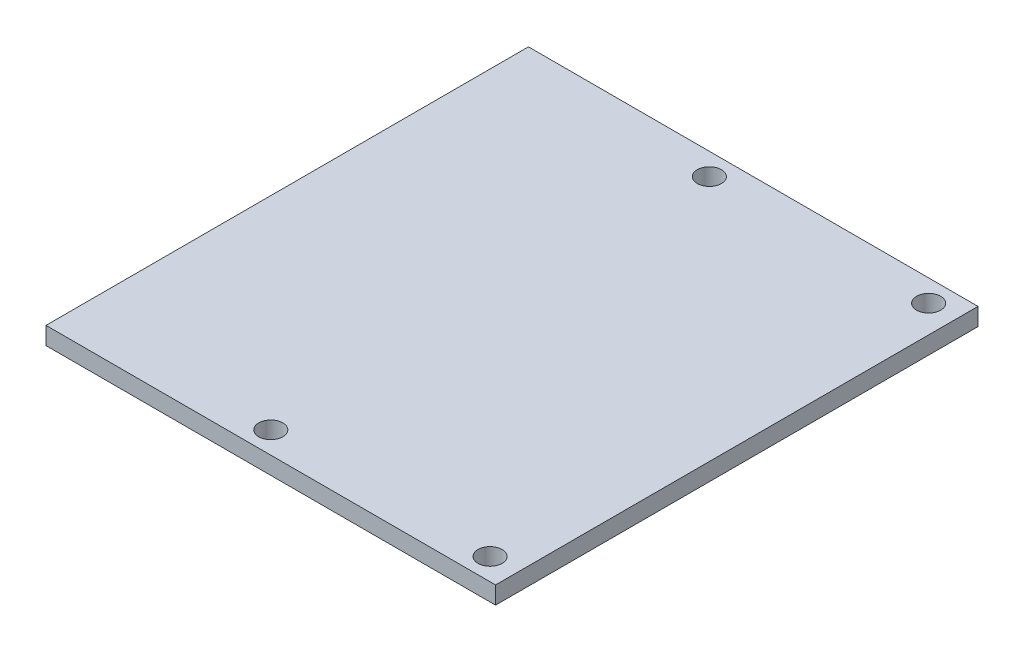
ISO-10303-21;
HEADER;
FILE_DESCRIPTION(('STEP AP214'),'2;1');
FILE_NAME('part.step','',(''),(''),'','','');
FILE_SCHEMA(('AUTOMOTIVE_DESIGN { 1 0 10303 214 1 1 1 1 }'));
ENDSEC;
DATA;
#1=APPLICATION_CONTEXT('core data for automotive mechanical design processes');
#2=APPLICATION_PROTOCOL_DEFINITION('international standard','automotive_design',2000,#1);
#3=PRODUCT_CONTEXT('',#1,'mechanical');
#4=PRODUCT('Part','Part','',(#3));
#5=PRODUCT_RELATED_PRODUCT_CATEGORY('part','',(#4));
#6=PRODUCT_DEFINITION_FORMATION('','',#4);
#7=PRODUCT_DEFINITION_CONTEXT('part definition',#1,'design');
#8=PRODUCT_DEFINITION('design','',#6,#7);
#9=PRODUCT_DEFINITION_SHAPE('','',#8);
#10=(LENGTH_UNIT() NAMED_UNIT(*) SI_UNIT(.MILLI.,.METRE.));
#11=(NAMED_UNIT(*) PLANE_ANGLE_UNIT() SI_UNIT($,.RADIAN.));
#12=(NAMED_UNIT(*) SI_UNIT($,.STERADIAN.) SOLID_ANGLE_UNIT());
#13=UNCERTAINTY_MEASURE_WITH_UNIT(LENGTH_MEASURE(1.E-05),#10,'distance_accuracy_value','');
#14=(GEOMETRIC_REPRESENTATION_CONTEXT(3) GLOBAL_UNCERTAINTY_ASSIGNED_CONTEXT((#13)) GLOBAL_UNIT_ASSIGNED_CONTEXT((#10,
#11,#12)) REPRESENTATION_CONTEXT('',''));
#15=CARTESIAN_POINT('',(0.,0.,0.));
#16=DIRECTION('',(0.,0.,1.));
#17=DIRECTION('',(1.,0.,0.));
#18=AXIS2_PLACEMENT_3D('',#15,#16,#17);
#19=CARTESIAN_POINT('',(0.,1.6,0.));
#20=DIRECTION('',(0.,-1.,0.));
#21=DIRECTION('',(0.,0.,-1.));
#22=AXIS2_PLACEMENT_3D('',#19,#20,#21);
#23=PLANE('',#22);
#24=CARTESIAN_POINT('',(38.5,1.6,-42.));
#25=DIRECTION('',(0.,1.,0.));
#26=DIRECTION('',(0.,0.,1.));
#27=AXIS2_PLACEMENT_3D('',#24,#25,#26);
#28=CIRCLE('',#27,1.1);
#29=CARTESIAN_POINT('',(38.5,1.6,-40.9));
#30=VERTEX_POINT('',#29);
#31=EDGE_CURVE('E121',#30,#30,#28,.T.);
#32=ORIENTED_EDGE('',*,*,#31,.F.);
#33=EDGE_LOOP('',(#32));
#34=FACE_BOUND('',#33,.T.);
#35=CARTESIAN_POINT('',(38.5,1.6,-2.));
#36=DIRECTION('',(0.,1.,0.));
#37=DIRECTION('',(0.,0.,1.));
#38=AXIS2_PLACEMENT_3D('',#35,#36,#37);
#39=CIRCLE('',#38,1.1);
#40=CARTESIAN_POINT('',(38.5,1.6,-0.900000000000001));
#41=VERTEX_POINT('',#40);
#42=EDGE_CURVE('E100',#41,#41,#39,.T.);
#43=ORIENTED_EDGE('',*,*,#42,.F.);
#44=EDGE_LOOP('',(#43));
#45=FACE_BOUND('',#44,.T.);
#46=DIRECTION('',(0.,0.,1.));
#47=VECTOR('',#46,1.);
#48=CARTESIAN_POINT('',(0.,1.6,0.));
#49=LINE('',#48,#47);
#50=CARTESIAN_POINT('',(0.,1.6,-44.));
#51=VERTEX_POINT('',#50);
#52=CARTESIAN_POINT('',(0.,1.6,0.));
#53=VERTEX_POINT('',#52);
#54=EDGE_CURVE('E85',#51,#53,#49,.T.);
#55=ORIENTED_EDGE('',*,*,#54,.T.);
#56=DIRECTION('',(1.,0.,0.));
#57=VECTOR('',#56,1.);
#58=CARTESIAN_POINT('',(0.,1.6,0.));
#59=LINE('',#58,#57);
#60=CARTESIAN_POINT('',(41.,1.6,0.));
#61=VERTEX_POINT('',#60);
#62=EDGE_CURVE('E80',#53,#61,#59,.T.);
#63=ORIENTED_EDGE('',*,*,#62,.T.);
#64=DIRECTION('',(0.,0.,-1.));
#65=VECTOR('',#64,1.);
#66=CARTESIAN_POINT('',(41.,1.6,0.));
#67=LINE('',#66,#65);
#68=CARTESIAN_POINT('',(41.,1.6,-44.));
#69=VERTEX_POINT('',#68);
#70=EDGE_CURVE('E83',#61,#69,#67,.T.);
#71=ORIENTED_EDGE('',*,*,#70,.T.);
#72=DIRECTION('',(-1.,0.,0.));
#73=VECTOR('',#72,1.);
#74=CARTESIAN_POINT('',(0.,1.6,-44.));
#75=LINE('',#74,#73);
#76=EDGE_CURVE('E50',#69,#51,#75,.T.);
#77=ORIENTED_EDGE('',*,*,#76,.T.);
#78=EDGE_LOOP('',(#55,#63,#71,#77));
#79=FACE_BOUND('',#78,.T.);
#80=CARTESIAN_POINT('',(18.5,1.6,-2.));
#81=DIRECTION('',(0.,1.,0.));
#82=DIRECTION('',(0.,0.,1.));
#83=AXIS2_PLACEMENT_3D('',#80,#81,#82);
#84=CIRCLE('',#83,1.1);
#85=CARTESIAN_POINT('',(18.5,1.6,-0.900000000000001));
#86=VERTEX_POINT('',#85);
#87=EDGE_CURVE('E115',#86,#86,#84,.T.);
#88=ORIENTED_EDGE('',*,*,#87,.F.);
#89=EDGE_LOOP('',(#88));
#90=FACE_BOUND('',#89,.T.);
#91=CARTESIAN_POINT('',(18.5,1.6,-42.));
#92=DIRECTION('',(0.,1.,0.));
#93=DIRECTION('',(0.,0.,1.));
#94=AXIS2_PLACEMENT_3D('',#91,#92,#93);
#95=CIRCLE('',#94,1.09999999999999);
#96=CARTESIAN_POINT('',(18.5,1.6,-40.9));
#97=VERTEX_POINT('',#96);
#98=EDGE_CURVE('E127',#97,#97,#95,.T.);
#99=ORIENTED_EDGE('',*,*,#98,.F.);
#100=EDGE_LOOP('',(#99));
#101=FACE_BOUND('',#100,.T.);
#102=ADVANCED_FACE('F33',(#34,#45,#79,#90,#101),#23,.F.);
#103=CARTESIAN_POINT('',(0.,0.,0.));
#104=DIRECTION('',(0.,-1.,0.));
#105=DIRECTION('',(0.,0.,-1.));
#106=AXIS2_PLACEMENT_3D('',#103,#104,#105);
#107=PLANE('',#106);
#108=CARTESIAN_POINT('',(38.5,0.,-42.));
#109=DIRECTION('',(0.,1.,0.));
#110=DIRECTION('',(0.,0.,1.));
#111=AXIS2_PLACEMENT_3D('',#108,#109,#110);
#112=CIRCLE('',#111,1.1);
#113=CARTESIAN_POINT('',(38.5,0.,-40.9));
#114=VERTEX_POINT('',#113);
#115=EDGE_CURVE('E124',#114,#114,#112,.T.);
#116=ORIENTED_EDGE('',*,*,#115,.T.);
#117=EDGE_LOOP('',(#116));
#118=FACE_BOUND('',#117,.T.);
#119=CARTESIAN_POINT('',(38.5,0.,-2.));
#120=DIRECTION('',(0.,1.,0.));
#121=DIRECTION('',(0.,0.,1.));
#122=AXIS2_PLACEMENT_3D('',#119,#120,#121);
#123=CIRCLE('',#122,1.1);
#124=CARTESIAN_POINT('',(38.5,0.,-0.900000000000001));
#125=VERTEX_POINT('',#124);
#126=EDGE_CURVE('E112',#125,#125,#123,.T.);
#127=ORIENTED_EDGE('',*,*,#126,.T.);
#128=EDGE_LOOP('',(#127));
#129=FACE_BOUND('',#128,.T.);
#130=DIRECTION('',(0.,0.,1.));
#131=VECTOR('',#130,1.);
#132=CARTESIAN_POINT('',(0.,0.,0.));
#133=LINE('',#132,#131);
#134=CARTESIAN_POINT('',(0.,0.,-44.));
#135=VERTEX_POINT('',#134);
#136=CARTESIAN_POINT('',(0.,0.,0.));
#137=VERTEX_POINT('',#136);
#138=EDGE_CURVE('E97',#135,#137,#133,.T.);
#139=ORIENTED_EDGE('',*,*,#138,.F.);
#140=DIRECTION('',(-1.,0.,0.));
#141=VECTOR('',#140,1.);
#142=CARTESIAN_POINT('',(0.,0.,-44.));
#143=LINE('',#142,#141);
#144=CARTESIAN_POINT('',(41.,0.,-44.));
#145=VERTEX_POINT('',#144);
#146=EDGE_CURVE('E73',#145,#135,#143,.T.);
#147=ORIENTED_EDGE('',*,*,#146,.F.);
#148=DIRECTION('',(0.,0.,-1.));
#149=VECTOR('',#148,1.);
#150=CARTESIAN_POINT('',(41.,0.,0.));
#151=LINE('',#150,#149);
#152=CARTESIAN_POINT('',(41.,0.,0.));
#153=VERTEX_POINT('',#152);
#154=EDGE_CURVE('E67',#153,#145,#151,.T.);
#155=ORIENTED_EDGE('',*,*,#154,.F.);
#156=DIRECTION('',(1.,0.,0.));
#157=VECTOR('',#156,1.);
#158=CARTESIAN_POINT('',(0.,0.,0.));
#159=LINE('',#158,#157);
#160=EDGE_CURVE('E89',#137,#153,#159,.T.);
#161=ORIENTED_EDGE('',*,*,#160,.F.);
#162=EDGE_LOOP('',(#139,#147,#155,#161));
#163=FACE_BOUND('',#162,.T.);
#164=CARTESIAN_POINT('',(18.5,0.,-2.));
#165=DIRECTION('',(0.,1.,0.));
#166=DIRECTION('',(0.,0.,1.));
#167=AXIS2_PLACEMENT_3D('',#164,#165,#166);
#168=CIRCLE('',#167,1.1);
#169=CARTESIAN_POINT('',(18.5,0.,-0.900000000000001));
#170=VERTEX_POINT('',#169);
#171=EDGE_CURVE('E118',#170,#170,#168,.T.);
#172=ORIENTED_EDGE('',*,*,#171,.T.);
#173=EDGE_LOOP('',(#172));
#174=FACE_BOUND('',#173,.T.);
#175=CARTESIAN_POINT('',(18.5,0.,-42.));
#176=DIRECTION('',(0.,1.,0.));
#177=DIRECTION('',(0.,0.,1.));
#178=AXIS2_PLACEMENT_3D('',#175,#176,#177);
#179=CIRCLE('',#178,1.09999999999999);
#180=CARTESIAN_POINT('',(18.5,0.,-40.9));
#181=VERTEX_POINT('',#180);
#182=EDGE_CURVE('E130',#181,#181,#179,.T.);
#183=ORIENTED_EDGE('',*,*,#182,.T.);
#184=EDGE_LOOP('',(#183));
#185=FACE_BOUND('',#184,.T.);
#186=ADVANCED_FACE('F108',(#118,#129,#163,#174,#185),#107,.T.);
#187=CARTESIAN_POINT('',(0.,1.6,0.));
#188=DIRECTION('',(1.,0.,0.));
#189=DIRECTION('',(0.,0.,-1.));
#190=AXIS2_PLACEMENT_3D('',#187,#188,#189);
#191=PLANE('',#190);
#192=ORIENTED_EDGE('',*,*,#138,.T.);
#193=DIRECTION('',(0.,-1.,0.));
#194=VECTOR('',#193,1.);
#195=CARTESIAN_POINT('',(0.,1.6,0.));
#196=LINE('',#195,#194);
#197=EDGE_CURVE('E11',#53,#137,#196,.T.);
#198=ORIENTED_EDGE('',*,*,#197,.F.);
#199=ORIENTED_EDGE('',*,*,#54,.F.);
#200=DIRECTION('',(0.,-1.,0.));
#201=VECTOR('',#200,1.);
#202=CARTESIAN_POINT('',(0.,1.6,-44.));
#203=LINE('',#202,#201);
#204=EDGE_CURVE('E93',#51,#135,#203,.T.);
#205=ORIENTED_EDGE('',*,*,#204,.T.);
#206=EDGE_LOOP('',(#192,#198,#199,#205));
#207=FACE_BOUND('',#206,.T.);
#208=ADVANCED_FACE('F35',(#207),#191,.F.);
#209=CARTESIAN_POINT('',(0.,1.6,0.));
#210=DIRECTION('',(0.,0.,-1.));
#211=DIRECTION('',(-1.,0.,0.));
#212=AXIS2_PLACEMENT_3D('',#209,#210,#211);
#213=PLANE('',#212);
#214=ORIENTED_EDGE('',*,*,#160,.T.);
#215=DIRECTION('',(0.,-1.,0.));
#216=VECTOR('',#215,1.);
#217=CARTESIAN_POINT('',(41.,1.6,0.));
#218=LINE('',#217,#216);
#219=EDGE_CURVE('E42',#61,#153,#218,.T.);
#220=ORIENTED_EDGE('',*,*,#219,.F.);
#221=ORIENTED_EDGE('',*,*,#62,.F.);
#222=ORIENTED_EDGE('',*,*,#197,.T.);
#223=EDGE_LOOP('',(#214,#220,#221,#222));
#224=FACE_BOUND('',#223,.T.);
#225=ADVANCED_FACE('F88',(#224),#213,.F.);
#226=CARTESIAN_POINT('',(41.,1.6,0.));
#227=DIRECTION('',(-1.,0.,0.));
#228=DIRECTION('',(0.,0.,1.));
#229=AXIS2_PLACEMENT_3D('',#226,#227,#228);
#230=PLANE('',#229);
#231=ORIENTED_EDGE('',*,*,#154,.T.);
#232=DIRECTION('',(0.,-1.,0.));
#233=VECTOR('',#232,1.);
#234=CARTESIAN_POINT('',(41.,1.6,-44.));
#235=LINE('',#234,#233);
#236=EDGE_CURVE('E90',#69,#145,#235,.T.);
#237=ORIENTED_EDGE('',*,*,#236,.F.);
#238=ORIENTED_EDGE('',*,*,#70,.F.);
#239=ORIENTED_EDGE('',*,*,#219,.T.);
#240=EDGE_LOOP('',(#231,#237,#238,#239));
#241=FACE_BOUND('',#240,.T.);
#242=ADVANCED_FACE('F91',(#241),#230,.F.);
#243=CARTESIAN_POINT('',(0.,1.6,-44.));
#244=DIRECTION('',(0.,0.,1.));
#245=DIRECTION('',(1.,0.,0.));
#246=AXIS2_PLACEMENT_3D('',#243,#244,#245);
#247=PLANE('',#246);
#248=ORIENTED_EDGE('',*,*,#146,.T.);
#249=ORIENTED_EDGE('',*,*,#204,.F.);
#250=ORIENTED_EDGE('',*,*,#76,.F.);
#251=ORIENTED_EDGE('',*,*,#236,.T.);
#252=EDGE_LOOP('',(#248,#249,#250,#251));
#253=FACE_BOUND('',#252,.T.);
#254=ADVANCED_FACE('F105',(#253),#247,.F.);
#255=CARTESIAN_POINT('',(38.5,1.6,-2.));
#256=DIRECTION('',(0.,-1.,0.));
#257=DIRECTION('',(0.,0.,-1.));
#258=AXIS2_PLACEMENT_3D('',#255,#256,#257);
#259=CYLINDRICAL_SURFACE('',#258,1.1);
#260=ORIENTED_EDGE('',*,*,#42,.T.);
#261=EDGE_LOOP('',(#260));
#262=FACE_BOUND('',#261,.T.);
#263=ORIENTED_EDGE('',*,*,#126,.F.);
#264=EDGE_LOOP('',(#263));
#265=FACE_BOUND('',#264,.T.);
#266=ADVANCED_FACE('F150',(#262,#265),#259,.F.);
#267=CARTESIAN_POINT('',(18.5,1.6,-2.));
#268=DIRECTION('',(0.,-1.,0.));
#269=DIRECTION('',(0.,0.,-1.));
#270=AXIS2_PLACEMENT_3D('',#267,#268,#269);
#271=CYLINDRICAL_SURFACE('',#270,1.1);
#272=ORIENTED_EDGE('',*,*,#87,.T.);
#273=EDGE_LOOP('',(#272));
#274=FACE_BOUND('',#273,.T.);
#275=ORIENTED_EDGE('',*,*,#171,.F.);
#276=EDGE_LOOP('',(#275));
#277=FACE_BOUND('',#276,.T.);
#278=ADVANCED_FACE('F196',(#274,#277),#271,.F.);
#279=CARTESIAN_POINT('',(38.5,1.6,-42.));
#280=DIRECTION('',(0.,-1.,0.));
#281=DIRECTION('',(0.,0.,-1.));
#282=AXIS2_PLACEMENT_3D('',#279,#280,#281);
#283=CYLINDRICAL_SURFACE('',#282,1.1);
#284=ORIENTED_EDGE('',*,*,#31,.T.);
#285=EDGE_LOOP('',(#284));
#286=FACE_BOUND('',#285,.T.);
#287=ORIENTED_EDGE('',*,*,#115,.F.);
#288=EDGE_LOOP('',(#287));
#289=FACE_BOUND('',#288,.T.);
#290=ADVANCED_FACE('F204',(#286,#289),#283,.F.);
#291=CARTESIAN_POINT('',(18.5,1.6,-42.));
#292=DIRECTION('',(0.,-1.,0.));
#293=DIRECTION('',(0.,0.,-1.));
#294=AXIS2_PLACEMENT_3D('',#291,#292,#293);
#295=CYLINDRICAL_SURFACE('',#294,1.09999999999999);
#296=ORIENTED_EDGE('',*,*,#98,.T.);
#297=EDGE_LOOP('',(#296));
#298=FACE_BOUND('',#297,.T.);
#299=ORIENTED_EDGE('',*,*,#182,.F.);
#300=EDGE_LOOP('',(#299));
#301=FACE_BOUND('',#300,.T.);
#302=ADVANCED_FACE('F136',(#298,#301),#295,.F.);
#303=CLOSED_SHELL('',(#102,#186,#208,#225,#242,#254,#266,#278,#290,#302));
#304=MANIFOLD_SOLID_BREP('B2',#303);
#305=ADVANCED_BREP_SHAPE_REPRESENTATION('',(#18,#304),#14);
#306=SHAPE_DEFINITION_REPRESENTATION(#9,#305);
ENDSEC;
END-ISO-10303-21;
